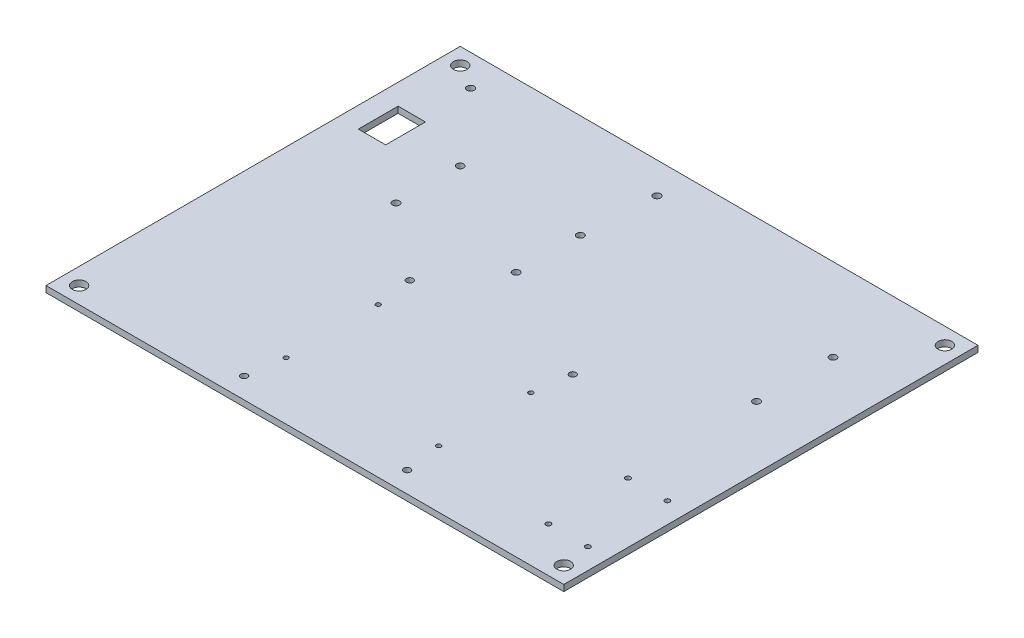
ISO-10303-21;
HEADER;
FILE_DESCRIPTION(('STEP AP214'),'2;1');
FILE_NAME('part.step','',(''),(''),'','','');
FILE_SCHEMA(('AUTOMOTIVE_DESIGN { 1 0 10303 214 1 1 1 1 }'));
ENDSEC;
DATA;
#1=APPLICATION_CONTEXT('core data for automotive mechanical design processes');
#2=APPLICATION_PROTOCOL_DEFINITION('international standard','automotive_design',2000,#1);
#3=PRODUCT_CONTEXT('',#1,'mechanical');
#4=PRODUCT('Part','Part','',(#3));
#5=PRODUCT_RELATED_PRODUCT_CATEGORY('part','',(#4));
#6=PRODUCT_DEFINITION_FORMATION('','',#4);
#7=PRODUCT_DEFINITION_CONTEXT('part definition',#1,'design');
#8=PRODUCT_DEFINITION('design','',#6,#7);
#9=PRODUCT_DEFINITION_SHAPE('','',#8);
#10=(LENGTH_UNIT() NAMED_UNIT(*) SI_UNIT(.MILLI.,.METRE.));
#11=(NAMED_UNIT(*) PLANE_ANGLE_UNIT() SI_UNIT($,.RADIAN.));
#12=(NAMED_UNIT(*) SI_UNIT($,.STERADIAN.) SOLID_ANGLE_UNIT());
#13=UNCERTAINTY_MEASURE_WITH_UNIT(LENGTH_MEASURE(1.E-05),#10,'distance_accuracy_value','');
#14=(GEOMETRIC_REPRESENTATION_CONTEXT(3) GLOBAL_UNCERTAINTY_ASSIGNED_CONTEXT((#13)) GLOBAL_UNIT_ASSIGNED_CONTEXT((#10,
#11,#12)) REPRESENTATION_CONTEXT('',''));
#15=CARTESIAN_POINT('',(0.,0.,0.));
#16=DIRECTION('',(0.,0.,1.));
#17=DIRECTION('',(1.,0.,0.));
#18=AXIS2_PLACEMENT_3D('',#15,#16,#17);
#19=CARTESIAN_POINT('',(125.,3.,100.));
#20=DIRECTION('',(-1.,0.,0.));
#21=DIRECTION('',(0.,0.,1.));
#22=AXIS2_PLACEMENT_3D('',#19,#20,#21);
#23=PLANE('',#22);
#24=DIRECTION('',(0.,0.,-1.));
#25=VECTOR('',#24,1.);
#26=CARTESIAN_POINT('',(125.,0.,100.));
#27=LINE('',#26,#25);
#28=CARTESIAN_POINT('',(125.,0.,100.));
#29=VERTEX_POINT('',#28);
#30=CARTESIAN_POINT('',(125.,0.,-100.));
#31=VERTEX_POINT('',#30);
#32=EDGE_CURVE('E144',#29,#31,#27,.T.);
#33=ORIENTED_EDGE('',*,*,#32,.T.);
#34=DIRECTION('',(0.,-1.,0.));
#35=VECTOR('',#34,1.);
#36=CARTESIAN_POINT('',(125.,3.,-100.));
#37=LINE('',#36,#35);
#38=CARTESIAN_POINT('',(125.,3.,-100.));
#39=VERTEX_POINT('',#38);
#40=EDGE_CURVE('E11',#39,#31,#37,.T.);
#41=ORIENTED_EDGE('',*,*,#40,.F.);
#42=DIRECTION('',(0.,0.,-1.));
#43=VECTOR('',#42,1.);
#44=CARTESIAN_POINT('',(125.,3.,100.));
#45=LINE('',#44,#43);
#46=CARTESIAN_POINT('',(125.,3.,100.));
#47=VERTEX_POINT('',#46);
#48=EDGE_CURVE('E145',#47,#39,#45,.T.);
#49=ORIENTED_EDGE('',*,*,#48,.F.);
#50=DIRECTION('',(0.,-1.,0.));
#51=VECTOR('',#50,1.);
#52=CARTESIAN_POINT('',(125.,3.,100.));
#53=LINE('',#52,#51);
#54=EDGE_CURVE('E155',#47,#29,#53,.T.);
#55=ORIENTED_EDGE('',*,*,#54,.T.);
#56=EDGE_LOOP('',(#33,#41,#49,#55));
#57=FACE_BOUND('',#56,.T.);
#58=ADVANCED_FACE('F37',(#57),#23,.F.);
#59=CARTESIAN_POINT('',(-125.,3.,-100.));
#60=DIRECTION('',(0.,0.,1.));
#61=DIRECTION('',(1.,0.,0.));
#62=AXIS2_PLACEMENT_3D('',#59,#60,#61);
#63=PLANE('',#62);
#64=DIRECTION('',(-1.,0.,0.));
#65=VECTOR('',#64,1.);
#66=CARTESIAN_POINT('',(-125.,0.,-100.));
#67=LINE('',#66,#65);
#68=CARTESIAN_POINT('',(-125.,0.,-100.));
#69=VERTEX_POINT('',#68);
#70=EDGE_CURVE('E158',#31,#69,#67,.T.);
#71=ORIENTED_EDGE('',*,*,#70,.T.);
#72=DIRECTION('',(0.,-1.,0.));
#73=VECTOR('',#72,1.);
#74=CARTESIAN_POINT('',(-125.,3.,-100.));
#75=LINE('',#74,#73);
#76=CARTESIAN_POINT('',(-125.,3.,-100.));
#77=VERTEX_POINT('',#76);
#78=EDGE_CURVE('E44',#77,#69,#75,.T.);
#79=ORIENTED_EDGE('',*,*,#78,.F.);
#80=DIRECTION('',(-1.,0.,0.));
#81=VECTOR('',#80,1.);
#82=CARTESIAN_POINT('',(-125.,3.,-100.));
#83=LINE('',#82,#81);
#84=EDGE_CURVE('E148',#39,#77,#83,.T.);
#85=ORIENTED_EDGE('',*,*,#84,.F.);
#86=ORIENTED_EDGE('',*,*,#40,.T.);
#87=EDGE_LOOP('',(#71,#79,#85,#86));
#88=FACE_BOUND('',#87,.T.);
#89=ADVANCED_FACE('F187',(#88),#63,.F.);
#90=CARTESIAN_POINT('',(-125.,3.,100.));
#91=DIRECTION('',(1.,0.,0.));
#92=DIRECTION('',(0.,0.,-1.));
#93=AXIS2_PLACEMENT_3D('',#90,#91,#92);
#94=PLANE('',#93);
#95=DIRECTION('',(0.,0.,1.));
#96=VECTOR('',#95,1.);
#97=CARTESIAN_POINT('',(-125.,0.,100.));
#98=LINE('',#97,#96);
#99=CARTESIAN_POINT('',(-125.,0.,100.));
#100=VERTEX_POINT('',#99);
#101=EDGE_CURVE('E160',#69,#100,#98,.T.);
#102=ORIENTED_EDGE('',*,*,#101,.T.);
#103=DIRECTION('',(0.,-1.,0.));
#104=VECTOR('',#103,1.);
#105=CARTESIAN_POINT('',(-125.,3.,100.));
#106=LINE('',#105,#104);
#107=CARTESIAN_POINT('',(-125.,3.,100.));
#108=VERTEX_POINT('',#107);
#109=EDGE_CURVE('E165',#108,#100,#106,.T.);
#110=ORIENTED_EDGE('',*,*,#109,.F.);
#111=DIRECTION('',(0.,0.,1.));
#112=VECTOR('',#111,1.);
#113=CARTESIAN_POINT('',(-125.,3.,100.));
#114=LINE('',#113,#112);
#115=EDGE_CURVE('E151',#77,#108,#114,.T.);
#116=ORIENTED_EDGE('',*,*,#115,.F.);
#117=ORIENTED_EDGE('',*,*,#78,.T.);
#118=EDGE_LOOP('',(#102,#110,#116,#117));
#119=FACE_BOUND('',#118,.T.);
#120=ADVANCED_FACE('F172',(#119),#94,.F.);
#121=CARTESIAN_POINT('',(-125.,3.,100.));
#122=DIRECTION('',(0.,0.,-1.));
#123=DIRECTION('',(-1.,0.,0.));
#124=AXIS2_PLACEMENT_3D('',#121,#122,#123);
#125=PLANE('',#124);
#126=DIRECTION('',(1.,0.,0.));
#127=VECTOR('',#126,1.);
#128=CARTESIAN_POINT('',(-125.,0.,100.));
#129=LINE('',#128,#127);
#130=EDGE_CURVE('E149',#100,#29,#129,.T.);
#131=ORIENTED_EDGE('',*,*,#130,.T.);
#132=ORIENTED_EDGE('',*,*,#54,.F.);
#133=DIRECTION('',(1.,0.,0.));
#134=VECTOR('',#133,1.);
#135=CARTESIAN_POINT('',(-125.,3.,100.));
#136=LINE('',#135,#134);
#137=EDGE_CURVE('E153',#108,#47,#136,.T.);
#138=ORIENTED_EDGE('',*,*,#137,.F.);
#139=ORIENTED_EDGE('',*,*,#109,.T.);
#140=EDGE_LOOP('',(#131,#132,#138,#139));
#141=FACE_BOUND('',#140,.T.);
#142=ADVANCED_FACE('F180',(#141),#125,.F.);
#143=CARTESIAN_POINT('',(0.,3.,0.));
#144=DIRECTION('',(0.,-1.,0.));
#145=DIRECTION('',(0.,0.,-1.));
#146=AXIS2_PLACEMENT_3D('',#143,#144,#145);
#147=PLANE('',#146);
#148=CARTESIAN_POINT('',(96.,3.,78.4));
#149=DIRECTION('',(0.,1.,0.));
#150=DIRECTION('',(0.,0.,1.));
#151=AXIS2_PLACEMENT_3D('',#148,#149,#150);
#152=CIRCLE('',#151,1.2);
#153=CARTESIAN_POINT('',(96.,3.,79.6));
#154=VERTEX_POINT('',#153);
#155=EDGE_CURVE('E406',#154,#154,#152,.T.);
#156=ORIENTED_EDGE('',*,*,#155,.F.);
#157=EDGE_LOOP('',(#156));
#158=FACE_BOUND('',#157,.T.);
#159=CARTESIAN_POINT('',(115.,3.,78.4));
#160=DIRECTION('',(0.,1.,0.));
#161=DIRECTION('',(0.,0.,1.));
#162=AXIS2_PLACEMENT_3D('',#159,#160,#161);
#163=CIRCLE('',#162,1.2);
#164=CARTESIAN_POINT('',(115.,3.,79.6));
#165=VERTEX_POINT('',#164);
#166=EDGE_CURVE('E400',#165,#165,#163,.T.);
#167=ORIENTED_EDGE('',*,*,#166,.F.);
#168=EDGE_LOOP('',(#167));
#169=FACE_BOUND('',#168,.T.);
#170=CARTESIAN_POINT('',(115.,3.,40.));
#171=DIRECTION('',(0.,1.,0.));
#172=DIRECTION('',(0.,0.,1.));
#173=AXIS2_PLACEMENT_3D('',#170,#171,#172);
#174=CIRCLE('',#173,1.2);
#175=CARTESIAN_POINT('',(115.,3.,41.2));
#176=VERTEX_POINT('',#175);
#177=EDGE_CURVE('E394',#176,#176,#174,.T.);
#178=ORIENTED_EDGE('',*,*,#177,.F.);
#179=EDGE_LOOP('',(#178));
#180=FACE_BOUND('',#179,.T.);
#181=CARTESIAN_POINT('',(96.,3.,40.));
#182=DIRECTION('',(0.,1.,0.));
#183=DIRECTION('',(0.,0.,1.));
#184=AXIS2_PLACEMENT_3D('',#181,#182,#183);
#185=CIRCLE('',#184,1.2);
#186=CARTESIAN_POINT('',(96.,3.,41.2));
#187=VERTEX_POINT('',#186);
#188=EDGE_CURVE('E388',#187,#187,#185,.T.);
#189=ORIENTED_EDGE('',*,*,#188,.F.);
#190=EDGE_LOOP('',(#189));
#191=FACE_BOUND('',#190,.T.);
#192=CARTESIAN_POINT('',(95.0000000000001,3.,-23.07));
#193=DIRECTION('',(0.,1.,0.));
#194=DIRECTION('',(0.,0.,1.));
#195=AXIS2_PLACEMENT_3D('',#192,#193,#194);
#196=CIRCLE('',#195,1.70000000000001);
#197=CARTESIAN_POINT('',(95.0000000000001,3.,-21.37));
#198=VERTEX_POINT('',#197);
#199=EDGE_CURVE('E382',#198,#198,#196,.T.);
#200=ORIENTED_EDGE('',*,*,#199,.F.);
#201=EDGE_LOOP('',(#200));
#202=FACE_BOUND('',#201,.T.);
#203=CARTESIAN_POINT('',(95.0000000000001,3.,-60.));
#204=DIRECTION('',(0.,1.,0.));
#205=DIRECTION('',(0.,0.,1.));
#206=AXIS2_PLACEMENT_3D('',#203,#204,#205);
#207=CIRCLE('',#206,1.70000000000001);
#208=CARTESIAN_POINT('',(95.0000000000001,3.,-58.3));
#209=VERTEX_POINT('',#208);
#210=EDGE_CURVE('E376',#209,#209,#207,.T.);
#211=ORIENTED_EDGE('',*,*,#210,.F.);
#212=EDGE_LOOP('',(#211));
#213=FACE_BOUND('',#212,.T.);
#214=CARTESIAN_POINT('',(-17.,3.,-19.));
#215=DIRECTION('',(0.,1.,0.));
#216=DIRECTION('',(0.,0.,1.));
#217=AXIS2_PLACEMENT_3D('',#214,#215,#216);
#218=CIRCLE('',#217,1.7);
#219=CARTESIAN_POINT('',(-17.,3.,-17.3));
#220=VERTEX_POINT('',#219);
#221=EDGE_CURVE('E369',#220,#220,#218,.T.);
#222=ORIENTED_EDGE('',*,*,#221,.F.);
#223=EDGE_LOOP('',(#222));
#224=FACE_BOUND('',#223,.T.);
#225=CARTESIAN_POINT('',(-75.,3.,-19.));
#226=DIRECTION('',(0.,1.,0.));
#227=DIRECTION('',(0.,0.,1.));
#228=AXIS2_PLACEMENT_3D('',#225,#226,#227);
#229=CIRCLE('',#228,1.7);
#230=CARTESIAN_POINT('',(-75.,3.,-17.3));
#231=VERTEX_POINT('',#230);
#232=EDGE_CURVE('E368',#231,#231,#229,.T.);
#233=ORIENTED_EDGE('',*,*,#232,.F.);
#234=EDGE_LOOP('',(#233));
#235=FACE_BOUND('',#234,.T.);
#236=CARTESIAN_POINT('',(-117.,3.,92.));
#237=DIRECTION('',(0.,1.,0.));
#238=DIRECTION('',(0.,0.,-1.));
#239=AXIS2_PLACEMENT_3D('',#236,#237,#238);
#240=CIRCLE('',#239,3.3);
#241=CARTESIAN_POINT('',(-117.,3.,88.7));
#242=VERTEX_POINT('',#241);
#243=EDGE_CURVE('E441',#242,#242,#240,.T.);
#244=ORIENTED_EDGE('',*,*,#243,.F.);
#245=EDGE_LOOP('',(#244));
#246=FACE_BOUND('',#245,.T.);
#247=CARTESIAN_POINT('',(-117.,3.,-92.));
#248=DIRECTION('',(0.,1.,0.));
#249=DIRECTION('',(0.,0.,1.));
#250=AXIS2_PLACEMENT_3D('',#247,#248,#249);
#251=CIRCLE('',#250,3.3);
#252=CARTESIAN_POINT('',(-117.,3.,-88.7));
#253=VERTEX_POINT('',#252);
#254=EDGE_CURVE('E440',#253,#253,#251,.T.);
#255=ORIENTED_EDGE('',*,*,#254,.F.);
#256=EDGE_LOOP('',(#255));
#257=FACE_BOUND('',#256,.T.);
#258=DIRECTION('',(0.,0.,-1.));
#259=VECTOR('',#258,1.);
#260=CARTESIAN_POINT('',(-101.8,3.,-60.));
#261=LINE('',#260,#259);
#262=CARTESIAN_POINT('',(-101.8,3.,-40.8));
#263=VERTEX_POINT('',#262);
#264=CARTESIAN_POINT('',(-101.8,3.,-60.));
#265=VERTEX_POINT('',#264);
#266=EDGE_CURVE('E115',#263,#265,#261,.T.);
#267=ORIENTED_EDGE('',*,*,#266,.F.);
#268=DIRECTION('',(1.,0.,0.));
#269=VECTOR('',#268,1.);
#270=CARTESIAN_POINT('',(-115.,3.,-40.8));
#271=LINE('',#270,#269);
#272=CARTESIAN_POINT('',(-115.,3.,-40.8));
#273=VERTEX_POINT('',#272);
#274=EDGE_CURVE('E132',#273,#263,#271,.T.);
#275=ORIENTED_EDGE('',*,*,#274,.F.);
#276=DIRECTION('',(0.,0.,1.));
#277=VECTOR('',#276,1.);
#278=CARTESIAN_POINT('',(-115.,3.,-60.));
#279=LINE('',#278,#277);
#280=CARTESIAN_POINT('',(-115.,3.,-60.));
#281=VERTEX_POINT('',#280);
#282=EDGE_CURVE('E129',#281,#273,#279,.T.);
#283=ORIENTED_EDGE('',*,*,#282,.F.);
#284=DIRECTION('',(-1.,0.,0.));
#285=VECTOR('',#284,1.);
#286=CARTESIAN_POINT('',(-115.,3.,-60.));
#287=LINE('',#286,#285);
#288=EDGE_CURVE('E51',#265,#281,#287,.T.);
#289=ORIENTED_EDGE('',*,*,#288,.F.);
#290=EDGE_LOOP('',(#267,#275,#283,#289));
#291=FACE_BOUND('',#290,.T.);
#292=CARTESIAN_POINT('',(-15.,3.,-85.));
#293=DIRECTION('',(0.,1.,0.));
#294=DIRECTION('',(0.,0.,1.));
#295=AXIS2_PLACEMENT_3D('',#292,#293,#294);
#296=CIRCLE('',#295,1.75);
#297=CARTESIAN_POINT('',(-15.,3.,-83.25));
#298=VERTEX_POINT('',#297);
#299=EDGE_CURVE('E141',#298,#298,#296,.T.);
#300=ORIENTED_EDGE('',*,*,#299,.F.);
#301=EDGE_LOOP('',(#300));
#302=FACE_BOUND('',#301,.T.);
#303=CARTESIAN_POINT('',(117.,3.,-92.));
#304=DIRECTION('',(0.,1.,0.));
#305=DIRECTION('',(0.,0.,-1.));
#306=AXIS2_PLACEMENT_3D('',#303,#304,#305);
#307=CIRCLE('',#306,3.3);
#308=CARTESIAN_POINT('',(117.,3.,-95.3));
#309=VERTEX_POINT('',#308);
#310=EDGE_CURVE('E416',#309,#309,#307,.T.);
#311=ORIENTED_EDGE('',*,*,#310,.F.);
#312=EDGE_LOOP('',(#311));
#313=FACE_BOUND('',#312,.T.);
#314=CARTESIAN_POINT('',(117.,3.,92.));
#315=DIRECTION('',(0.,1.,0.));
#316=DIRECTION('',(0.,0.,1.));
#317=AXIS2_PLACEMENT_3D('',#314,#315,#316);
#318=CIRCLE('',#317,3.3);
#319=CARTESIAN_POINT('',(117.,3.,95.3));
#320=VERTEX_POINT('',#319);
#321=EDGE_CURVE('E417',#320,#320,#318,.T.);
#322=ORIENTED_EDGE('',*,*,#321,.F.);
#323=EDGE_LOOP('',(#322));
#324=FACE_BOUND('',#323,.T.);
#325=CARTESIAN_POINT('',(-75.,3.,-50.));
#326=DIRECTION('',(0.,1.,0.));
#327=DIRECTION('',(0.,0.,1.));
#328=AXIS2_PLACEMENT_3D('',#325,#326,#327);
#329=CIRCLE('',#328,1.7);
#330=CARTESIAN_POINT('',(-75.,3.,-48.3));
#331=VERTEX_POINT('',#330);
#332=EDGE_CURVE('E424',#331,#331,#329,.T.);
#333=ORIENTED_EDGE('',*,*,#332,.F.);
#334=EDGE_LOOP('',(#333));
#335=FACE_BOUND('',#334,.T.);
#336=CARTESIAN_POINT('',(-17.,3.,-50.));
#337=DIRECTION('',(0.,1.,0.));
#338=DIRECTION('',(0.,0.,1.));
#339=AXIS2_PLACEMENT_3D('',#336,#337,#338);
#340=CIRCLE('',#339,1.7);
#341=CARTESIAN_POINT('',(-17.,3.,-48.3));
#342=VERTEX_POINT('',#341);
#343=EDGE_CURVE('E430',#342,#342,#340,.T.);
#344=ORIENTED_EDGE('',*,*,#343,.F.);
#345=EDGE_LOOP('',(#344));
#346=FACE_BOUND('',#345,.T.);
#347=CARTESIAN_POINT('',(-36.85,3.,72.25));
#348=DIRECTION('',(0.,1.,0.));
#349=DIRECTION('',(0.,0.,1.));
#350=AXIS2_PLACEMENT_3D('',#347,#348,#349);
#351=CIRCLE('',#350,1.10000000000001);
#352=CARTESIAN_POINT('',(-36.85,3.,73.35));
#353=VERTEX_POINT('',#352);
#354=EDGE_CURVE('E333',#353,#353,#351,.T.);
#355=ORIENTED_EDGE('',*,*,#354,.F.);
#356=EDGE_LOOP('',(#355));
#357=FACE_BOUND('',#356,.T.);
#358=CARTESIAN_POINT('',(36.85,3.,72.25));
#359=DIRECTION('',(0.,1.,0.));
#360=DIRECTION('',(0.,0.,1.));
#361=AXIS2_PLACEMENT_3D('',#358,#359,#360);
#362=CIRCLE('',#361,1.10000000000001);
#363=CARTESIAN_POINT('',(36.85,3.,73.35));
#364=VERTEX_POINT('',#363);
#365=EDGE_CURVE('E328',#364,#364,#362,.T.);
#366=ORIENTED_EDGE('',*,*,#365,.F.);
#367=EDGE_LOOP('',(#366));
#368=FACE_BOUND('',#367,.T.);
#369=CARTESIAN_POINT('',(36.85,3.,27.75));
#370=DIRECTION('',(0.,1.,0.));
#371=DIRECTION('',(0.,0.,1.));
#372=AXIS2_PLACEMENT_3D('',#369,#370,#371);
#373=CIRCLE('',#372,1.10000000000001);
#374=CARTESIAN_POINT('',(36.85,3.,28.85));
#375=VERTEX_POINT('',#374);
#376=EDGE_CURVE('E319',#375,#375,#373,.T.);
#377=ORIENTED_EDGE('',*,*,#376,.F.);
#378=EDGE_LOOP('',(#377));
#379=FACE_BOUND('',#378,.T.);
#380=CARTESIAN_POINT('',(-36.85,3.,27.75));
#381=DIRECTION('',(0.,1.,0.));
#382=DIRECTION('',(0.,0.,1.));
#383=AXIS2_PLACEMENT_3D('',#380,#381,#382);
#384=CIRCLE('',#383,1.10000000000001);
#385=CARTESIAN_POINT('',(-36.85,3.,28.85));
#386=VERTEX_POINT('',#385);
#387=EDGE_CURVE('E314',#386,#386,#384,.T.);
#388=ORIENTED_EDGE('',*,*,#387,.F.);
#389=EDGE_LOOP('',(#388));
#390=FACE_BOUND('',#389,.T.);
#391=CARTESIAN_POINT('',(39.35,3.,90.));
#392=DIRECTION('',(0.,1.,0.));
#393=DIRECTION('',(0.,0.,1.));
#394=AXIS2_PLACEMENT_3D('',#391,#392,#393);
#395=CIRCLE('',#394,1.6);
#396=CARTESIAN_POINT('',(39.35,3.,91.6));
#397=VERTEX_POINT('',#396);
#398=EDGE_CURVE('E358',#397,#397,#395,.T.);
#399=ORIENTED_EDGE('',*,*,#398,.F.);
#400=EDGE_LOOP('',(#399));
#401=FACE_BOUND('',#400,.T.);
#402=CARTESIAN_POINT('',(-39.35,3.,90.));
#403=DIRECTION('',(0.,1.,0.));
#404=DIRECTION('',(0.,0.,1.));
#405=AXIS2_PLACEMENT_3D('',#402,#403,#404);
#406=CIRCLE('',#405,1.6);
#407=CARTESIAN_POINT('',(-39.35,3.,91.6));
#408=VERTEX_POINT('',#407);
#409=EDGE_CURVE('E352',#408,#408,#406,.T.);
#410=ORIENTED_EDGE('',*,*,#409,.F.);
#411=EDGE_LOOP('',(#410));
#412=FACE_BOUND('',#411,.T.);
#413=CARTESIAN_POINT('',(39.35,3.,9.99999999999998));
#414=DIRECTION('',(0.,1.,0.));
#415=DIRECTION('',(0.,0.,1.));
#416=AXIS2_PLACEMENT_3D('',#413,#414,#415);
#417=CIRCLE('',#416,1.6);
#418=CARTESIAN_POINT('',(39.35,3.,11.6));
#419=VERTEX_POINT('',#418);
#420=EDGE_CURVE('E345',#419,#419,#417,.T.);
#421=ORIENTED_EDGE('',*,*,#420,.F.);
#422=EDGE_LOOP('',(#421));
#423=FACE_BOUND('',#422,.T.);
#424=CARTESIAN_POINT('',(-39.35,3.,9.99999999999998));
#425=DIRECTION('',(0.,1.,0.));
#426=DIRECTION('',(0.,0.,1.));
#427=AXIS2_PLACEMENT_3D('',#424,#425,#426);
#428=CIRCLE('',#427,1.6);
#429=CARTESIAN_POINT('',(-39.35,3.,11.6));
#430=VERTEX_POINT('',#429);
#431=EDGE_CURVE('E344',#430,#430,#428,.T.);
#432=ORIENTED_EDGE('',*,*,#431,.F.);
#433=EDGE_LOOP('',(#432));
#434=FACE_BOUND('',#433,.T.);
#435=CARTESIAN_POINT('',(-105.,3.,-85.));
#436=DIRECTION('',(0.,1.,0.));
#437=DIRECTION('',(0.,0.,1.));
#438=AXIS2_PLACEMENT_3D('',#435,#436,#437);
#439=CIRCLE('',#438,1.75);
#440=CARTESIAN_POINT('',(-105.,3.,-83.25));
#441=VERTEX_POINT('',#440);
#442=EDGE_CURVE('E137',#441,#441,#439,.T.);
#443=ORIENTED_EDGE('',*,*,#442,.F.);
#444=EDGE_LOOP('',(#443));
#445=FACE_BOUND('',#444,.T.);
#446=ORIENTED_EDGE('',*,*,#48,.T.);
#447=ORIENTED_EDGE('',*,*,#84,.T.);
#448=ORIENTED_EDGE('',*,*,#115,.T.);
#449=ORIENTED_EDGE('',*,*,#137,.T.);
#450=EDGE_LOOP('',(#446,#447,#448,#449));
#451=FACE_BOUND('',#450,.T.);
#452=ADVANCED_FACE('F186',(#158,#169,#180,#191,#202,#213,#224,#235,#246,#257,#291,#302,#313,
#324,#335,#346,#357,#368,#379,#390,#401,#412,#423,#434,#445,#451),#147,.F.);
#453=CARTESIAN_POINT('',(0.,0.,0.));
#454=DIRECTION('',(0.,-1.,0.));
#455=DIRECTION('',(0.,0.,-1.));
#456=AXIS2_PLACEMENT_3D('',#453,#454,#455);
#457=PLANE('',#456);
#458=CARTESIAN_POINT('',(96.,0.,78.4));
#459=DIRECTION('',(0.,-1.,0.));
#460=DIRECTION('',(0.,0.,-1.));
#461=AXIS2_PLACEMENT_3D('',#458,#459,#460);
#462=CIRCLE('',#461,1.2);
#463=CARTESIAN_POINT('',(96.,0.,77.2));
#464=VERTEX_POINT('',#463);
#465=EDGE_CURVE('E348',#464,#464,#462,.F.);
#466=ORIENTED_EDGE('',*,*,#465,.T.);
#467=EDGE_LOOP('',(#466));
#468=FACE_BOUND('',#467,.T.);
#469=CARTESIAN_POINT('',(115.,0.,78.4));
#470=DIRECTION('',(0.,-1.,0.));
#471=DIRECTION('',(0.,0.,-1.));
#472=AXIS2_PLACEMENT_3D('',#469,#470,#471);
#473=CIRCLE('',#472,1.2);
#474=CARTESIAN_POINT('',(115.,0.,77.2));
#475=VERTEX_POINT('',#474);
#476=EDGE_CURVE('E403',#475,#475,#473,.F.);
#477=ORIENTED_EDGE('',*,*,#476,.T.);
#478=EDGE_LOOP('',(#477));
#479=FACE_BOUND('',#478,.T.);
#480=CARTESIAN_POINT('',(115.,0.,40.));
#481=DIRECTION('',(0.,-1.,0.));
#482=DIRECTION('',(0.,0.,-1.));
#483=AXIS2_PLACEMENT_3D('',#480,#481,#482);
#484=CIRCLE('',#483,1.2);
#485=CARTESIAN_POINT('',(115.,0.,38.8));
#486=VERTEX_POINT('',#485);
#487=EDGE_CURVE('E397',#486,#486,#484,.F.);
#488=ORIENTED_EDGE('',*,*,#487,.T.);
#489=EDGE_LOOP('',(#488));
#490=FACE_BOUND('',#489,.T.);
#491=CARTESIAN_POINT('',(96.,0.,40.));
#492=DIRECTION('',(0.,-1.,0.));
#493=DIRECTION('',(0.,0.,-1.));
#494=AXIS2_PLACEMENT_3D('',#491,#492,#493);
#495=CIRCLE('',#494,1.2);
#496=CARTESIAN_POINT('',(96.,0.,38.8));
#497=VERTEX_POINT('',#496);
#498=EDGE_CURVE('E391',#497,#497,#495,.F.);
#499=ORIENTED_EDGE('',*,*,#498,.T.);
#500=EDGE_LOOP('',(#499));
#501=FACE_BOUND('',#500,.T.);
#502=CARTESIAN_POINT('',(95.0000000000001,0.,-23.07));
#503=DIRECTION('',(0.,-1.,0.));
#504=DIRECTION('',(0.,0.,-1.));
#505=AXIS2_PLACEMENT_3D('',#502,#503,#504);
#506=CIRCLE('',#505,1.70000000000001);
#507=CARTESIAN_POINT('',(95.0000000000001,0.,-24.77));
#508=VERTEX_POINT('',#507);
#509=EDGE_CURVE('E385',#508,#508,#506,.F.);
#510=ORIENTED_EDGE('',*,*,#509,.T.);
#511=EDGE_LOOP('',(#510));
#512=FACE_BOUND('',#511,.T.);
#513=CARTESIAN_POINT('',(95.0000000000001,0.,-60.));
#514=DIRECTION('',(0.,-1.,0.));
#515=DIRECTION('',(0.,0.,-1.));
#516=AXIS2_PLACEMENT_3D('',#513,#514,#515);
#517=CIRCLE('',#516,1.70000000000001);
#518=CARTESIAN_POINT('',(95.0000000000001,0.,-61.7));
#519=VERTEX_POINT('',#518);
#520=EDGE_CURVE('E379',#519,#519,#517,.F.);
#521=ORIENTED_EDGE('',*,*,#520,.T.);
#522=EDGE_LOOP('',(#521));
#523=FACE_BOUND('',#522,.T.);
#524=CARTESIAN_POINT('',(-17.,0.,-19.));
#525=DIRECTION('',(0.,-1.,0.));
#526=DIRECTION('',(0.,0.,-1.));
#527=AXIS2_PLACEMENT_3D('',#524,#525,#526);
#528=CIRCLE('',#527,1.7);
#529=CARTESIAN_POINT('',(-17.,0.,-20.7));
#530=VERTEX_POINT('',#529);
#531=EDGE_CURVE('E373',#530,#530,#528,.F.);
#532=ORIENTED_EDGE('',*,*,#531,.T.);
#533=EDGE_LOOP('',(#532));
#534=FACE_BOUND('',#533,.T.);
#535=CARTESIAN_POINT('',(-75.,0.,-19.));
#536=DIRECTION('',(0.,-1.,0.));
#537=DIRECTION('',(0.,0.,-1.));
#538=AXIS2_PLACEMENT_3D('',#535,#536,#537);
#539=CIRCLE('',#538,1.7);
#540=CARTESIAN_POINT('',(-75.,0.,-20.7));
#541=VERTEX_POINT('',#540);
#542=EDGE_CURVE('E365',#541,#541,#539,.F.);
#543=ORIENTED_EDGE('',*,*,#542,.T.);
#544=EDGE_LOOP('',(#543));
#545=FACE_BOUND('',#544,.T.);
#546=CARTESIAN_POINT('',(-117.,0.,92.));
#547=DIRECTION('',(0.,-1.,0.));
#548=DIRECTION('',(0.,0.,-1.));
#549=AXIS2_PLACEMENT_3D('',#546,#547,#548);
#550=CIRCLE('',#549,3.3);
#551=CARTESIAN_POINT('',(-117.,0.,88.7));
#552=VERTEX_POINT('',#551);
#553=EDGE_CURVE('E420',#552,#552,#550,.F.);
#554=ORIENTED_EDGE('',*,*,#553,.T.);
#555=EDGE_LOOP('',(#554));
#556=FACE_BOUND('',#555,.T.);
#557=CARTESIAN_POINT('',(-117.,0.,-92.));
#558=DIRECTION('',(0.,-1.,0.));
#559=DIRECTION('',(0.,0.,-1.));
#560=AXIS2_PLACEMENT_3D('',#557,#558,#559);
#561=CIRCLE('',#560,3.3);
#562=CARTESIAN_POINT('',(-117.,0.,-95.3));
#563=VERTEX_POINT('',#562);
#564=EDGE_CURVE('E437',#563,#563,#561,.F.);
#565=ORIENTED_EDGE('',*,*,#564,.T.);
#566=EDGE_LOOP('',(#565));
#567=FACE_BOUND('',#566,.T.);
#568=DIRECTION('',(1.,0.,0.));
#569=VECTOR('',#568,1.);
#570=CARTESIAN_POINT('',(-115.,0.,-40.8));
#571=LINE('',#570,#569);
#572=CARTESIAN_POINT('',(-115.,0.,-40.8));
#573=VERTEX_POINT('',#572);
#574=CARTESIAN_POINT('',(-101.8,0.,-40.8));
#575=VERTEX_POINT('',#574);
#576=EDGE_CURVE('E120',#573,#575,#571,.T.);
#577=ORIENTED_EDGE('',*,*,#576,.T.);
#578=DIRECTION('',(0.,0.,-1.));
#579=VECTOR('',#578,1.);
#580=CARTESIAN_POINT('',(-101.8,0.,-60.));
#581=LINE('',#580,#579);
#582=CARTESIAN_POINT('',(-101.8,0.,-60.));
#583=VERTEX_POINT('',#582);
#584=EDGE_CURVE('E112',#575,#583,#581,.T.);
#585=ORIENTED_EDGE('',*,*,#584,.T.);
#586=DIRECTION('',(-1.,0.,0.));
#587=VECTOR('',#586,1.);
#588=CARTESIAN_POINT('',(-115.,0.,-60.));
#589=LINE('',#588,#587);
#590=CARTESIAN_POINT('',(-115.,0.,-60.));
#591=VERTEX_POINT('',#590);
#592=EDGE_CURVE('E100',#583,#591,#589,.T.);
#593=ORIENTED_EDGE('',*,*,#592,.T.);
#594=DIRECTION('',(0.,0.,1.));
#595=VECTOR('',#594,1.);
#596=CARTESIAN_POINT('',(-115.,0.,-60.));
#597=LINE('',#596,#595);
#598=EDGE_CURVE('E126',#591,#573,#597,.T.);
#599=ORIENTED_EDGE('',*,*,#598,.T.);
#600=EDGE_LOOP('',(#577,#585,#593,#599));
#601=FACE_BOUND('',#600,.T.);
#602=CARTESIAN_POINT('',(-15.,0.,-85.));
#603=DIRECTION('',(0.,-1.,0.));
#604=DIRECTION('',(0.,0.,-1.));
#605=AXIS2_PLACEMENT_3D('',#602,#603,#604);
#606=CIRCLE('',#605,1.75);
#607=CARTESIAN_POINT('',(-15.,0.,-86.75));
#608=VERTEX_POINT('',#607);
#609=EDGE_CURVE('E131',#608,#608,#606,.F.);
#610=ORIENTED_EDGE('',*,*,#609,.T.);
#611=EDGE_LOOP('',(#610));
#612=FACE_BOUND('',#611,.T.);
#613=CARTESIAN_POINT('',(117.,0.,-92.));
#614=DIRECTION('',(0.,-1.,0.));
#615=DIRECTION('',(0.,0.,-1.));
#616=AXIS2_PLACEMENT_3D('',#613,#614,#615);
#617=CIRCLE('',#616,3.3);
#618=CARTESIAN_POINT('',(117.,0.,-95.3));
#619=VERTEX_POINT('',#618);
#620=EDGE_CURVE('E413',#619,#619,#617,.F.);
#621=ORIENTED_EDGE('',*,*,#620,.T.);
#622=EDGE_LOOP('',(#621));
#623=FACE_BOUND('',#622,.T.);
#624=CARTESIAN_POINT('',(117.,0.,92.));
#625=DIRECTION('',(0.,-1.,0.));
#626=DIRECTION('',(0.,0.,-1.));
#627=AXIS2_PLACEMENT_3D('',#624,#625,#626);
#628=CIRCLE('',#627,3.3);
#629=CARTESIAN_POINT('',(117.,0.,88.7));
#630=VERTEX_POINT('',#629);
#631=EDGE_CURVE('E421',#630,#630,#628,.F.);
#632=ORIENTED_EDGE('',*,*,#631,.T.);
#633=EDGE_LOOP('',(#632));
#634=FACE_BOUND('',#633,.T.);
#635=CARTESIAN_POINT('',(-75.,0.,-50.));
#636=DIRECTION('',(0.,-1.,0.));
#637=DIRECTION('',(0.,0.,-1.));
#638=AXIS2_PLACEMENT_3D('',#635,#636,#637);
#639=CIRCLE('',#638,1.7);
#640=CARTESIAN_POINT('',(-75.,0.,-51.7));
#641=VERTEX_POINT('',#640);
#642=EDGE_CURVE('E427',#641,#641,#639,.F.);
#643=ORIENTED_EDGE('',*,*,#642,.T.);
#644=EDGE_LOOP('',(#643));
#645=FACE_BOUND('',#644,.T.);
#646=CARTESIAN_POINT('',(-17.,0.,-50.));
#647=DIRECTION('',(0.,-1.,0.));
#648=DIRECTION('',(0.,0.,-1.));
#649=AXIS2_PLACEMENT_3D('',#646,#647,#648);
#650=CIRCLE('',#649,1.7);
#651=CARTESIAN_POINT('',(-17.,0.,-51.7));
#652=VERTEX_POINT('',#651);
#653=EDGE_CURVE('E372',#652,#652,#650,.F.);
#654=ORIENTED_EDGE('',*,*,#653,.T.);
#655=EDGE_LOOP('',(#654));
#656=FACE_BOUND('',#655,.T.);
#657=CARTESIAN_POINT('',(-36.85,0.,72.25));
#658=DIRECTION('',(0.,-1.,0.));
#659=DIRECTION('',(0.,0.,-1.));
#660=AXIS2_PLACEMENT_3D('',#657,#658,#659);
#661=CIRCLE('',#660,1.10000000000001);
#662=CARTESIAN_POINT('',(-36.85,0.,71.15));
#663=VERTEX_POINT('',#662);
#664=EDGE_CURVE('E336',#663,#663,#661,.F.);
#665=ORIENTED_EDGE('',*,*,#664,.T.);
#666=EDGE_LOOP('',(#665));
#667=FACE_BOUND('',#666,.T.);
#668=CARTESIAN_POINT('',(36.85,0.,72.25));
#669=DIRECTION('',(0.,-1.,0.));
#670=DIRECTION('',(0.,0.,-1.));
#671=AXIS2_PLACEMENT_3D('',#668,#669,#670);
#672=CIRCLE('',#671,1.10000000000001);
#673=CARTESIAN_POINT('',(36.85,0.,71.15));
#674=VERTEX_POINT('',#673);
#675=EDGE_CURVE('E330',#674,#674,#672,.F.);
#676=ORIENTED_EDGE('',*,*,#675,.T.);
#677=EDGE_LOOP('',(#676));
#678=FACE_BOUND('',#677,.T.);
#679=CARTESIAN_POINT('',(36.85,0.,27.75));
#680=DIRECTION('',(0.,-1.,0.));
#681=DIRECTION('',(0.,0.,-1.));
#682=AXIS2_PLACEMENT_3D('',#679,#680,#681);
#683=CIRCLE('',#682,1.10000000000001);
#684=CARTESIAN_POINT('',(36.85,0.,26.65));
#685=VERTEX_POINT('',#684);
#686=EDGE_CURVE('E324',#685,#685,#683,.F.);
#687=ORIENTED_EDGE('',*,*,#686,.T.);
#688=EDGE_LOOP('',(#687));
#689=FACE_BOUND('',#688,.T.);
#690=CARTESIAN_POINT('',(-36.85,0.,27.75));
#691=DIRECTION('',(0.,-1.,0.));
#692=DIRECTION('',(0.,0.,-1.));
#693=AXIS2_PLACEMENT_3D('',#690,#691,#692);
#694=CIRCLE('',#693,1.10000000000001);
#695=CARTESIAN_POINT('',(-36.85,0.,26.65));
#696=VERTEX_POINT('',#695);
#697=EDGE_CURVE('E317',#696,#696,#694,.F.);
#698=ORIENTED_EDGE('',*,*,#697,.T.);
#699=EDGE_LOOP('',(#698));
#700=FACE_BOUND('',#699,.T.);
#701=CARTESIAN_POINT('',(39.35,0.,90.));
#702=DIRECTION('',(0.,-1.,0.));
#703=DIRECTION('',(0.,0.,-1.));
#704=AXIS2_PLACEMENT_3D('',#701,#702,#703);
#705=CIRCLE('',#704,1.6);
#706=CARTESIAN_POINT('',(39.35,0.,88.4));
#707=VERTEX_POINT('',#706);
#708=EDGE_CURVE('E321',#707,#707,#705,.F.);
#709=ORIENTED_EDGE('',*,*,#708,.T.);
#710=EDGE_LOOP('',(#709));
#711=FACE_BOUND('',#710,.T.);
#712=CARTESIAN_POINT('',(-39.35,0.,90.));
#713=DIRECTION('',(0.,-1.,0.));
#714=DIRECTION('',(0.,0.,-1.));
#715=AXIS2_PLACEMENT_3D('',#712,#713,#714);
#716=CIRCLE('',#715,1.6);
#717=CARTESIAN_POINT('',(-39.35,0.,88.4));
#718=VERTEX_POINT('',#717);
#719=EDGE_CURVE('E355',#718,#718,#716,.F.);
#720=ORIENTED_EDGE('',*,*,#719,.T.);
#721=EDGE_LOOP('',(#720));
#722=FACE_BOUND('',#721,.T.);
#723=CARTESIAN_POINT('',(39.35,0.,9.99999999999998));
#724=DIRECTION('',(0.,-1.,0.));
#725=DIRECTION('',(0.,0.,-1.));
#726=AXIS2_PLACEMENT_3D('',#723,#724,#725);
#727=CIRCLE('',#726,1.6);
#728=CARTESIAN_POINT('',(39.35,0.,8.39999999999998));
#729=VERTEX_POINT('',#728);
#730=EDGE_CURVE('E349',#729,#729,#727,.F.);
#731=ORIENTED_EDGE('',*,*,#730,.T.);
#732=EDGE_LOOP('',(#731));
#733=FACE_BOUND('',#732,.T.);
#734=CARTESIAN_POINT('',(-39.35,0.,9.99999999999998));
#735=DIRECTION('',(0.,-1.,0.));
#736=DIRECTION('',(0.,0.,-1.));
#737=AXIS2_PLACEMENT_3D('',#734,#735,#736);
#738=CIRCLE('',#737,1.6);
#739=CARTESIAN_POINT('',(-39.35,0.,8.39999999999998));
#740=VERTEX_POINT('',#739);
#741=EDGE_CURVE('E341',#740,#740,#738,.F.);
#742=ORIENTED_EDGE('',*,*,#741,.T.);
#743=EDGE_LOOP('',(#742));
#744=FACE_BOUND('',#743,.T.);
#745=CARTESIAN_POINT('',(-105.,0.,-85.));
#746=DIRECTION('',(0.,-1.,0.));
#747=DIRECTION('',(0.,0.,-1.));
#748=AXIS2_PLACEMENT_3D('',#745,#746,#747);
#749=CIRCLE('',#748,1.75);
#750=CARTESIAN_POINT('',(-105.,0.,-86.75));
#751=VERTEX_POINT('',#750);
#752=EDGE_CURVE('E140',#751,#751,#749,.F.);
#753=ORIENTED_EDGE('',*,*,#752,.T.);
#754=EDGE_LOOP('',(#753));
#755=FACE_BOUND('',#754,.T.);
#756=ORIENTED_EDGE('',*,*,#32,.F.);
#757=ORIENTED_EDGE('',*,*,#130,.F.);
#758=ORIENTED_EDGE('',*,*,#101,.F.);
#759=ORIENTED_EDGE('',*,*,#70,.F.);
#760=EDGE_LOOP('',(#756,#757,#758,#759));
#761=FACE_BOUND('',#760,.T.);
#762=ADVANCED_FACE('F118',(#468,#479,#490,#501,#512,#523,#534,#545,#556,#567,#601,#612,#623,
#634,#645,#656,#667,#678,#689,#700,#711,#722,#733,#744,#755,#761),#457,.T.);
#763=CARTESIAN_POINT('',(-105.,-23.2997854067371,-85.));
#764=DIRECTION('',(0.,1.,0.));
#765=DIRECTION('',(0.,0.,1.));
#766=AXIS2_PLACEMENT_3D('',#763,#764,#765);
#767=CYLINDRICAL_SURFACE('',#766,1.75);
#768=ORIENTED_EDGE('',*,*,#442,.T.);
#769=EDGE_LOOP('',(#768));
#770=FACE_BOUND('',#769,.T.);
#771=ORIENTED_EDGE('',*,*,#752,.F.);
#772=EDGE_LOOP('',(#771));
#773=FACE_BOUND('',#772,.T.);
#774=ADVANCED_FACE('F199',(#770,#773),#767,.F.);
#775=CARTESIAN_POINT('',(-39.35,-23.2997854067371,9.99999999999998));
#776=DIRECTION('',(0.,1.,0.));
#777=DIRECTION('',(0.,0.,1.));
#778=AXIS2_PLACEMENT_3D('',#775,#776,#777);
#779=CYLINDRICAL_SURFACE('',#778,1.6);
#780=ORIENTED_EDGE('',*,*,#431,.T.);
#781=EDGE_LOOP('',(#780));
#782=FACE_BOUND('',#781,.T.);
#783=ORIENTED_EDGE('',*,*,#741,.F.);
#784=EDGE_LOOP('',(#783));
#785=FACE_BOUND('',#784,.T.);
#786=ADVANCED_FACE('F206',(#782,#785),#779,.F.);
#787=CARTESIAN_POINT('',(39.35,-23.2997854067371,9.99999999999998));
#788=DIRECTION('',(0.,1.,0.));
#789=DIRECTION('',(0.,0.,1.));
#790=AXIS2_PLACEMENT_3D('',#787,#788,#789);
#791=CYLINDRICAL_SURFACE('',#790,1.6);
#792=ORIENTED_EDGE('',*,*,#420,.T.);
#793=EDGE_LOOP('',(#792));
#794=FACE_BOUND('',#793,.T.);
#795=ORIENTED_EDGE('',*,*,#730,.F.);
#796=EDGE_LOOP('',(#795));
#797=FACE_BOUND('',#796,.T.);
#798=ADVANCED_FACE('F288',(#794,#797),#791,.F.);
#799=CARTESIAN_POINT('',(-39.35,-23.2997854067371,90.));
#800=DIRECTION('',(0.,1.,0.));
#801=DIRECTION('',(0.,0.,1.));
#802=AXIS2_PLACEMENT_3D('',#799,#800,#801);
#803=CYLINDRICAL_SURFACE('',#802,1.6);
#804=ORIENTED_EDGE('',*,*,#409,.T.);
#805=EDGE_LOOP('',(#804));
#806=FACE_BOUND('',#805,.T.);
#807=ORIENTED_EDGE('',*,*,#719,.F.);
#808=EDGE_LOOP('',(#807));
#809=FACE_BOUND('',#808,.T.);
#810=ADVANCED_FACE('F284',(#806,#809),#803,.F.);
#811=CARTESIAN_POINT('',(39.35,-23.2997854067371,90.));
#812=DIRECTION('',(0.,1.,0.));
#813=DIRECTION('',(0.,0.,1.));
#814=AXIS2_PLACEMENT_3D('',#811,#812,#813);
#815=CYLINDRICAL_SURFACE('',#814,1.6);
#816=ORIENTED_EDGE('',*,*,#398,.T.);
#817=EDGE_LOOP('',(#816));
#818=FACE_BOUND('',#817,.T.);
#819=ORIENTED_EDGE('',*,*,#708,.F.);
#820=EDGE_LOOP('',(#819));
#821=FACE_BOUND('',#820,.T.);
#822=ADVANCED_FACE('F280',(#818,#821),#815,.F.);
#823=CARTESIAN_POINT('',(-36.85,-23.2997854067371,27.75));
#824=DIRECTION('',(0.,1.,0.));
#825=DIRECTION('',(0.,0.,1.));
#826=AXIS2_PLACEMENT_3D('',#823,#824,#825);
#827=CYLINDRICAL_SURFACE('',#826,1.10000000000001);
#828=ORIENTED_EDGE('',*,*,#387,.T.);
#829=EDGE_LOOP('',(#828));
#830=FACE_BOUND('',#829,.T.);
#831=ORIENTED_EDGE('',*,*,#697,.F.);
#832=EDGE_LOOP('',(#831));
#833=FACE_BOUND('',#832,.T.);
#834=ADVANCED_FACE('F283',(#830,#833),#827,.F.);
#835=CARTESIAN_POINT('',(36.85,-23.2997854067371,27.75));
#836=DIRECTION('',(0.,1.,0.));
#837=DIRECTION('',(0.,0.,1.));
#838=AXIS2_PLACEMENT_3D('',#835,#836,#837);
#839=CYLINDRICAL_SURFACE('',#838,1.10000000000001);
#840=ORIENTED_EDGE('',*,*,#376,.T.);
#841=EDGE_LOOP('',(#840));
#842=FACE_BOUND('',#841,.T.);
#843=ORIENTED_EDGE('',*,*,#686,.F.);
#844=EDGE_LOOP('',(#843));
#845=FACE_BOUND('',#844,.T.);
#846=ADVANCED_FACE('F302',(#842,#845),#839,.F.);
#847=CARTESIAN_POINT('',(36.85,-23.2997854067371,72.25));
#848=DIRECTION('',(0.,1.,0.));
#849=DIRECTION('',(0.,0.,1.));
#850=AXIS2_PLACEMENT_3D('',#847,#848,#849);
#851=CYLINDRICAL_SURFACE('',#850,1.10000000000001);
#852=ORIENTED_EDGE('',*,*,#365,.T.);
#853=EDGE_LOOP('',(#852));
#854=FACE_BOUND('',#853,.T.);
#855=ORIENTED_EDGE('',*,*,#675,.F.);
#856=EDGE_LOOP('',(#855));
#857=FACE_BOUND('',#856,.T.);
#858=ADVANCED_FACE('F298',(#854,#857),#851,.F.);
#859=CARTESIAN_POINT('',(-36.85,-23.2997854067371,72.25));
#860=DIRECTION('',(0.,1.,0.));
#861=DIRECTION('',(0.,0.,1.));
#862=AXIS2_PLACEMENT_3D('',#859,#860,#861);
#863=CYLINDRICAL_SURFACE('',#862,1.10000000000001);
#864=ORIENTED_EDGE('',*,*,#354,.T.);
#865=EDGE_LOOP('',(#864));
#866=FACE_BOUND('',#865,.T.);
#867=ORIENTED_EDGE('',*,*,#664,.F.);
#868=EDGE_LOOP('',(#867));
#869=FACE_BOUND('',#868,.T.);
#870=ADVANCED_FACE('F237',(#866,#869),#863,.F.);
#871=CARTESIAN_POINT('',(-17.,-23.2997854067371,-50.));
#872=DIRECTION('',(0.,1.,0.));
#873=DIRECTION('',(0.,0.,1.));
#874=AXIS2_PLACEMENT_3D('',#871,#872,#873);
#875=CYLINDRICAL_SURFACE('',#874,1.7);
#876=ORIENTED_EDGE('',*,*,#343,.T.);
#877=EDGE_LOOP('',(#876));
#878=FACE_BOUND('',#877,.T.);
#879=ORIENTED_EDGE('',*,*,#653,.F.);
#880=EDGE_LOOP('',(#879));
#881=FACE_BOUND('',#880,.T.);
#882=ADVANCED_FACE('F233',(#878,#881),#875,.F.);
#883=CARTESIAN_POINT('',(-75.,-23.2997854067371,-50.));
#884=DIRECTION('',(0.,1.,0.));
#885=DIRECTION('',(0.,0.,1.));
#886=AXIS2_PLACEMENT_3D('',#883,#884,#885);
#887=CYLINDRICAL_SURFACE('',#886,1.7);
#888=ORIENTED_EDGE('',*,*,#332,.T.);
#889=EDGE_LOOP('',(#888));
#890=FACE_BOUND('',#889,.T.);
#891=ORIENTED_EDGE('',*,*,#642,.F.);
#892=EDGE_LOOP('',(#891));
#893=FACE_BOUND('',#892,.T.);
#894=ADVANCED_FACE('F236',(#890,#893),#887,.F.);
#895=CARTESIAN_POINT('',(117.,-23.2997854067371,92.));
#896=DIRECTION('',(0.,1.,0.));
#897=DIRECTION('',(0.,0.,1.));
#898=AXIS2_PLACEMENT_3D('',#895,#896,#897);
#899=CYLINDRICAL_SURFACE('',#898,3.3);
#900=ORIENTED_EDGE('',*,*,#321,.T.);
#901=EDGE_LOOP('',(#900));
#902=FACE_BOUND('',#901,.T.);
#903=ORIENTED_EDGE('',*,*,#631,.F.);
#904=EDGE_LOOP('',(#903));
#905=FACE_BOUND('',#904,.T.);
#906=ADVANCED_FACE('F241',(#902,#905),#899,.F.);
#907=CARTESIAN_POINT('',(117.,-23.2997854067371,-92.));
#908=DIRECTION('',(0.,1.,0.));
#909=DIRECTION('',(0.,0.,1.));
#910=AXIS2_PLACEMENT_3D('',#907,#908,#909);
#911=CYLINDRICAL_SURFACE('',#910,3.3);
#912=ORIENTED_EDGE('',*,*,#310,.T.);
#913=EDGE_LOOP('',(#912));
#914=FACE_BOUND('',#913,.T.);
#915=ORIENTED_EDGE('',*,*,#620,.F.);
#916=EDGE_LOOP('',(#915));
#917=FACE_BOUND('',#916,.T.);
#918=ADVANCED_FACE('F223',(#914,#917),#911,.F.);
#919=CARTESIAN_POINT('',(-15.,-23.2997854067371,-85.));
#920=DIRECTION('',(0.,1.,0.));
#921=DIRECTION('',(0.,0.,1.));
#922=AXIS2_PLACEMENT_3D('',#919,#920,#921);
#923=CYLINDRICAL_SURFACE('',#922,1.75);
#924=ORIENTED_EDGE('',*,*,#299,.T.);
#925=EDGE_LOOP('',(#924));
#926=FACE_BOUND('',#925,.T.);
#927=ORIENTED_EDGE('',*,*,#609,.F.);
#928=EDGE_LOOP('',(#927));
#929=FACE_BOUND('',#928,.T.);
#930=ADVANCED_FACE('F219',(#926,#929),#923,.F.);
#931=CARTESIAN_POINT('',(-115.,-23.2997854067371,-40.8));
#932=DIRECTION('',(0.,0.,1.));
#933=DIRECTION('',(1.,0.,0.));
#934=AXIS2_PLACEMENT_3D('',#931,#932,#933);
#935=PLANE('',#934);
#936=DIRECTION('',(0.,1.,0.));
#937=VECTOR('',#936,1.);
#938=CARTESIAN_POINT('',(-115.,-23.2997854067371,-40.8));
#939=LINE('',#938,#937);
#940=EDGE_CURVE('E59',#573,#273,#939,.T.);
#941=ORIENTED_EDGE('',*,*,#940,.T.);
#942=ORIENTED_EDGE('',*,*,#274,.T.);
#943=DIRECTION('',(0.,1.,0.));
#944=VECTOR('',#943,1.);
#945=CARTESIAN_POINT('',(-101.8,-23.2997854067371,-40.8));
#946=LINE('',#945,#944);
#947=EDGE_CURVE('E121',#575,#263,#946,.T.);
#948=ORIENTED_EDGE('',*,*,#947,.F.);
#949=ORIENTED_EDGE('',*,*,#576,.F.);
#950=EDGE_LOOP('',(#941,#942,#948,#949));
#951=FACE_BOUND('',#950,.T.);
#952=ADVANCED_FACE('F216',(#951),#935,.F.);
#953=CARTESIAN_POINT('',(-101.8,-23.2997854067371,-60.));
#954=DIRECTION('',(1.,0.,0.));
#955=DIRECTION('',(0.,0.,-1.));
#956=AXIS2_PLACEMENT_3D('',#953,#954,#955);
#957=PLANE('',#956);
#958=ORIENTED_EDGE('',*,*,#947,.T.);
#959=ORIENTED_EDGE('',*,*,#266,.T.);
#960=DIRECTION('',(0.,1.,0.));
#961=VECTOR('',#960,1.);
#962=CARTESIAN_POINT('',(-101.8,-23.2997854067371,-60.));
#963=LINE('',#962,#961);
#964=EDGE_CURVE('E103',#583,#265,#963,.T.);
#965=ORIENTED_EDGE('',*,*,#964,.F.);
#966=ORIENTED_EDGE('',*,*,#584,.F.);
#967=EDGE_LOOP('',(#958,#959,#965,#966));
#968=FACE_BOUND('',#967,.T.);
#969=ADVANCED_FACE('F111',(#968),#957,.F.);
#970=CARTESIAN_POINT('',(-115.,-23.2997854067371,-60.));
#971=DIRECTION('',(0.,0.,-1.));
#972=DIRECTION('',(-1.,0.,0.));
#973=AXIS2_PLACEMENT_3D('',#970,#971,#972);
#974=PLANE('',#973);
#975=ORIENTED_EDGE('',*,*,#964,.T.);
#976=ORIENTED_EDGE('',*,*,#288,.T.);
#977=DIRECTION('',(0.,1.,0.));
#978=VECTOR('',#977,1.);
#979=CARTESIAN_POINT('',(-115.,-23.2997854067371,-60.));
#980=LINE('',#979,#978);
#981=EDGE_CURVE('E105',#591,#281,#980,.T.);
#982=ORIENTED_EDGE('',*,*,#981,.F.);
#983=ORIENTED_EDGE('',*,*,#592,.F.);
#984=EDGE_LOOP('',(#975,#976,#982,#983));
#985=FACE_BOUND('',#984,.T.);
#986=ADVANCED_FACE('F102',(#985),#974,.F.);
#987=CARTESIAN_POINT('',(-115.,-23.2997854067371,-60.));
#988=DIRECTION('',(-1.,0.,0.));
#989=DIRECTION('',(0.,0.,1.));
#990=AXIS2_PLACEMENT_3D('',#987,#988,#989);
#991=PLANE('',#990);
#992=ORIENTED_EDGE('',*,*,#981,.T.);
#993=ORIENTED_EDGE('',*,*,#282,.T.);
#994=ORIENTED_EDGE('',*,*,#940,.F.);
#995=ORIENTED_EDGE('',*,*,#598,.F.);
#996=EDGE_LOOP('',(#992,#993,#994,#995));
#997=FACE_BOUND('',#996,.T.);
#998=ADVANCED_FACE('F208',(#997),#991,.F.);
#999=CARTESIAN_POINT('',(-117.,-23.2997854067371,-92.));
#1000=DIRECTION('',(0.,1.,0.));
#1001=DIRECTION('',(0.,0.,1.));
#1002=AXIS2_PLACEMENT_3D('',#999,#1000,#1001);
#1003=CYLINDRICAL_SURFACE('',#1002,3.3);
#1004=ORIENTED_EDGE('',*,*,#254,.T.);
#1005=EDGE_LOOP('',(#1004));
#1006=FACE_BOUND('',#1005,.T.);
#1007=ORIENTED_EDGE('',*,*,#564,.F.);
#1008=EDGE_LOOP('',(#1007));
#1009=FACE_BOUND('',#1008,.T.);
#1010=ADVANCED_FACE('F211',(#1006,#1009),#1003,.F.);
#1011=CARTESIAN_POINT('',(-117.,-23.2997854067371,92.));
#1012=DIRECTION('',(0.,1.,0.));
#1013=DIRECTION('',(0.,0.,1.));
#1014=AXIS2_PLACEMENT_3D('',#1011,#1012,#1013);
#1015=CYLINDRICAL_SURFACE('',#1014,3.3);
#1016=ORIENTED_EDGE('',*,*,#243,.T.);
#1017=EDGE_LOOP('',(#1016));
#1018=FACE_BOUND('',#1017,.T.);
#1019=ORIENTED_EDGE('',*,*,#553,.F.);
#1020=EDGE_LOOP('',(#1019));
#1021=FACE_BOUND('',#1020,.T.);
#1022=ADVANCED_FACE('F225',(#1018,#1021),#1015,.F.);
#1023=CARTESIAN_POINT('',(-75.,-23.2997854067371,-19.));
#1024=DIRECTION('',(0.,1.,0.));
#1025=DIRECTION('',(0.,0.,1.));
#1026=AXIS2_PLACEMENT_3D('',#1023,#1024,#1025);
#1027=CYLINDRICAL_SURFACE('',#1026,1.7);
#1028=ORIENTED_EDGE('',*,*,#232,.T.);
#1029=EDGE_LOOP('',(#1028));
#1030=FACE_BOUND('',#1029,.T.);
#1031=ORIENTED_EDGE('',*,*,#542,.F.);
#1032=EDGE_LOOP('',(#1031));
#1033=FACE_BOUND('',#1032,.T.);
#1034=ADVANCED_FACE('F228',(#1030,#1033),#1027,.F.);
#1035=CARTESIAN_POINT('',(-17.,-23.2997854067371,-19.));
#1036=DIRECTION('',(0.,1.,0.));
#1037=DIRECTION('',(0.,0.,1.));
#1038=AXIS2_PLACEMENT_3D('',#1035,#1036,#1037);
#1039=CYLINDRICAL_SURFACE('',#1038,1.7);
#1040=ORIENTED_EDGE('',*,*,#221,.T.);
#1041=EDGE_LOOP('',(#1040));
#1042=FACE_BOUND('',#1041,.T.);
#1043=ORIENTED_EDGE('',*,*,#531,.F.);
#1044=EDGE_LOOP('',(#1043));
#1045=FACE_BOUND('',#1044,.T.);
#1046=ADVANCED_FACE('F272',(#1042,#1045),#1039,.F.);
#1047=CARTESIAN_POINT('',(95.0000000000001,-23.2997854067371,-60.));
#1048=DIRECTION('',(0.,1.,0.));
#1049=DIRECTION('',(0.,0.,1.));
#1050=AXIS2_PLACEMENT_3D('',#1047,#1048,#1049);
#1051=CYLINDRICAL_SURFACE('',#1050,1.70000000000001);
#1052=ORIENTED_EDGE('',*,*,#210,.T.);
#1053=EDGE_LOOP('',(#1052));
#1054=FACE_BOUND('',#1053,.T.);
#1055=ORIENTED_EDGE('',*,*,#520,.F.);
#1056=EDGE_LOOP('',(#1055));
#1057=FACE_BOUND('',#1056,.T.);
#1058=ADVANCED_FACE('F268',(#1054,#1057),#1051,.F.);
#1059=CARTESIAN_POINT('',(95.0000000000001,-23.2997854067371,-23.07));
#1060=DIRECTION('',(0.,1.,0.));
#1061=DIRECTION('',(0.,0.,1.));
#1062=AXIS2_PLACEMENT_3D('',#1059,#1060,#1061);
#1063=CYLINDRICAL_SURFACE('',#1062,1.70000000000001);
#1064=ORIENTED_EDGE('',*,*,#199,.T.);
#1065=EDGE_LOOP('',(#1064));
#1066=FACE_BOUND('',#1065,.T.);
#1067=ORIENTED_EDGE('',*,*,#509,.F.);
#1068=EDGE_LOOP('',(#1067));
#1069=FACE_BOUND('',#1068,.T.);
#1070=ADVANCED_FACE('F264',(#1066,#1069),#1063,.F.);
#1071=CARTESIAN_POINT('',(96.,-23.2997854067371,40.));
#1072=DIRECTION('',(0.,1.,0.));
#1073=DIRECTION('',(0.,0.,1.));
#1074=AXIS2_PLACEMENT_3D('',#1071,#1072,#1073);
#1075=CYLINDRICAL_SURFACE('',#1074,1.2);
#1076=ORIENTED_EDGE('',*,*,#188,.T.);
#1077=EDGE_LOOP('',(#1076));
#1078=FACE_BOUND('',#1077,.T.);
#1079=ORIENTED_EDGE('',*,*,#498,.F.);
#1080=EDGE_LOOP('',(#1079));
#1081=FACE_BOUND('',#1080,.T.);
#1082=ADVANCED_FACE('F260',(#1078,#1081),#1075,.F.);
#1083=CARTESIAN_POINT('',(115.,-23.2997854067371,40.));
#1084=DIRECTION('',(0.,1.,0.));
#1085=DIRECTION('',(0.,0.,1.));
#1086=AXIS2_PLACEMENT_3D('',#1083,#1084,#1085);
#1087=CYLINDRICAL_SURFACE('',#1086,1.2);
#1088=ORIENTED_EDGE('',*,*,#177,.T.);
#1089=EDGE_LOOP('',(#1088));
#1090=FACE_BOUND('',#1089,.T.);
#1091=ORIENTED_EDGE('',*,*,#487,.F.);
#1092=EDGE_LOOP('',(#1091));
#1093=FACE_BOUND('',#1092,.T.);
#1094=ADVANCED_FACE('F256',(#1090,#1093),#1087,.F.);
#1095=CARTESIAN_POINT('',(115.,-23.2997854067371,78.4));
#1096=DIRECTION('',(0.,1.,0.));
#1097=DIRECTION('',(0.,0.,1.));
#1098=AXIS2_PLACEMENT_3D('',#1095,#1096,#1097);
#1099=CYLINDRICAL_SURFACE('',#1098,1.2);
#1100=ORIENTED_EDGE('',*,*,#166,.T.);
#1101=EDGE_LOOP('',(#1100));
#1102=FACE_BOUND('',#1101,.T.);
#1103=ORIENTED_EDGE('',*,*,#476,.F.);
#1104=EDGE_LOOP('',(#1103));
#1105=FACE_BOUND('',#1104,.T.);
#1106=ADVANCED_FACE('F252',(#1102,#1105),#1099,.F.);
#1107=CARTESIAN_POINT('',(96.,-23.2997854067371,78.4));
#1108=DIRECTION('',(0.,1.,0.));
#1109=DIRECTION('',(0.,0.,1.));
#1110=AXIS2_PLACEMENT_3D('',#1107,#1108,#1109);
#1111=CYLINDRICAL_SURFACE('',#1110,1.2);
#1112=ORIENTED_EDGE('',*,*,#155,.T.);
#1113=EDGE_LOOP('',(#1112));
#1114=FACE_BOUND('',#1113,.T.);
#1115=ORIENTED_EDGE('',*,*,#465,.F.);
#1116=EDGE_LOOP('',(#1115));
#1117=FACE_BOUND('',#1116,.T.);
#1118=ADVANCED_FACE('F249',(#1114,#1117),#1111,.F.);
#1119=CLOSED_SHELL('',(#58,#89,#120,#142,#452,#762,#774,#786,#798,#810,#822,#834,#846,#858,#870,
#882,#894,#906,#918,#930,#952,#969,#986,#998,#1010,#1022,#1034,#1046,#1058,#1070,#1082,#1094,
#1106,#1118));
#1120=MANIFOLD_SOLID_BREP('B2',#1119);
#1121=ADVANCED_BREP_SHAPE_REPRESENTATION('',(#18,#1120),#14);
#1122=SHAPE_DEFINITION_REPRESENTATION(#9,#1121);
ENDSEC;
END-ISO-10303-21;
